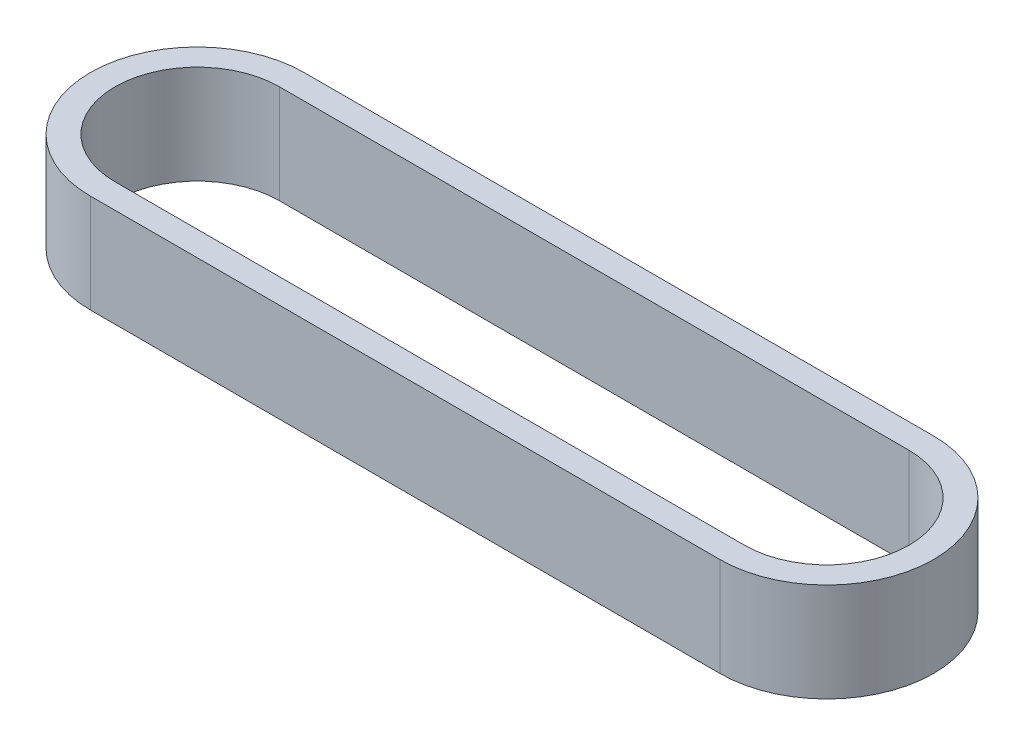
ISO-10303-21;
HEADER;
FILE_DESCRIPTION(('STEP AP214'),'2;1');
FILE_NAME('part.step','',(''),(''),'','','');
FILE_SCHEMA(('AUTOMOTIVE_DESIGN { 1 0 10303 214 1 1 1 1 }'));
ENDSEC;
DATA;
#1=APPLICATION_CONTEXT('core data for automotive mechanical design processes');
#2=APPLICATION_PROTOCOL_DEFINITION('international standard','automotive_design',2000,#1);
#3=PRODUCT_CONTEXT('',#1,'mechanical');
#4=PRODUCT('Part','Part','',(#3));
#5=PRODUCT_RELATED_PRODUCT_CATEGORY('part','',(#4));
#6=PRODUCT_DEFINITION_FORMATION('','',#4);
#7=PRODUCT_DEFINITION_CONTEXT('part definition',#1,'design');
#8=PRODUCT_DEFINITION('design','',#6,#7);
#9=PRODUCT_DEFINITION_SHAPE('','',#8);
#10=(LENGTH_UNIT() NAMED_UNIT(*) SI_UNIT(.MILLI.,.METRE.));
#11=(NAMED_UNIT(*) PLANE_ANGLE_UNIT() SI_UNIT($,.RADIAN.));
#12=(NAMED_UNIT(*) SI_UNIT($,.STERADIAN.) SOLID_ANGLE_UNIT());
#13=UNCERTAINTY_MEASURE_WITH_UNIT(LENGTH_MEASURE(1.E-05),#10,'distance_accuracy_value','');
#14=(GEOMETRIC_REPRESENTATION_CONTEXT(3) GLOBAL_UNCERTAINTY_ASSIGNED_CONTEXT((#13)) GLOBAL_UNIT_ASSIGNED_CONTEXT((#10,
#11,#12)) REPRESENTATION_CONTEXT('',''));
#15=CARTESIAN_POINT('',(0.,0.,0.));
#16=DIRECTION('',(0.,0.,1.));
#17=DIRECTION('',(1.,0.,0.));
#18=AXIS2_PLACEMENT_3D('',#15,#16,#17);
#19=CARTESIAN_POINT('',(0.,3.,0.));
#20=DIRECTION('',(0.,1.,0.));
#21=DIRECTION('',(0.,0.,1.));
#22=AXIS2_PLACEMENT_3D('',#19,#20,#21);
#23=PLANE('',#22);
#24=CARTESIAN_POINT('',(0.,3.,0.));
#25=DIRECTION('',(0.,1.,0.));
#26=DIRECTION('',(0.,0.,1.));
#27=AXIS2_PLACEMENT_3D('',#24,#25,#26);
#28=CIRCLE('',#27,6.49999999999999);
#29=CARTESIAN_POINT('',(0.,3.,-6.49999999999999));
#30=VERTEX_POINT('',#29);
#31=CARTESIAN_POINT('',(0.,3.,6.49999999999999));
#32=VERTEX_POINT('',#31);
#33=EDGE_CURVE('E153',#30,#32,#28,.T.);
#34=ORIENTED_EDGE('',*,*,#33,.T.);
#35=DIRECTION('',(1.,0.,0.));
#36=VECTOR('',#35,1.);
#37=CARTESIAN_POINT('',(38.27,3.,6.5));
#38=LINE('',#37,#36);
#39=CARTESIAN_POINT('',(38.27,3.,6.5));
#40=VERTEX_POINT('',#39);
#41=EDGE_CURVE('E157',#32,#40,#38,.T.);
#42=ORIENTED_EDGE('',*,*,#41,.T.);
#43=CARTESIAN_POINT('',(38.27,3.,0.));
#44=DIRECTION('',(0.,1.,0.));
#45=DIRECTION('',(0.,0.,-1.));
#46=AXIS2_PLACEMENT_3D('',#43,#44,#45);
#47=CIRCLE('',#46,6.5);
#48=CARTESIAN_POINT('',(38.27,3.,-6.5));
#49=VERTEX_POINT('',#48);
#50=EDGE_CURVE('E161',#40,#49,#47,.T.);
#51=ORIENTED_EDGE('',*,*,#50,.T.);
#52=DIRECTION('',(-1.,0.,0.));
#53=VECTOR('',#52,1.);
#54=CARTESIAN_POINT('',(0.,3.,-6.49999999999999));
#55=LINE('',#54,#53);
#56=EDGE_CURVE('E164',#49,#30,#55,.T.);
#57=ORIENTED_EDGE('',*,*,#56,.T.);
#58=EDGE_LOOP('',(#34,#42,#51,#57));
#59=FACE_BOUND('',#58,.T.);
#60=DIRECTION('',(1.,0.,0.));
#61=VECTOR('',#60,1.);
#62=CARTESIAN_POINT('',(38.27,3.,5.));
#63=LINE('',#62,#61);
#64=CARTESIAN_POINT('',(0.,3.,4.99999999999999));
#65=VERTEX_POINT('',#64);
#66=CARTESIAN_POINT('',(38.27,3.,5.));
#67=VERTEX_POINT('',#66);
#68=EDGE_CURVE('E114',#65,#67,#63,.T.);
#69=ORIENTED_EDGE('',*,*,#68,.F.);
#70=CARTESIAN_POINT('',(0.,3.,0.));
#71=DIRECTION('',(0.,1.,0.));
#72=DIRECTION('',(0.,0.,1.));
#73=AXIS2_PLACEMENT_3D('',#70,#71,#72);
#74=CIRCLE('',#73,4.99999999999999);
#75=CARTESIAN_POINT('',(0.,3.,-4.99999999999999));
#76=VERTEX_POINT('',#75);
#77=EDGE_CURVE('E105',#76,#65,#74,.T.);
#78=ORIENTED_EDGE('',*,*,#77,.F.);
#79=DIRECTION('',(-1.,0.,0.));
#80=VECTOR('',#79,1.);
#81=CARTESIAN_POINT('',(0.,3.,-4.99999999999999));
#82=LINE('',#81,#80);
#83=CARTESIAN_POINT('',(38.27,3.,-5.));
#84=VERTEX_POINT('',#83);
#85=EDGE_CURVE('E131',#84,#76,#82,.T.);
#86=ORIENTED_EDGE('',*,*,#85,.F.);
#87=CARTESIAN_POINT('',(38.27,3.,0.));
#88=DIRECTION('',(0.,1.,0.));
#89=DIRECTION('',(0.,0.,-1.));
#90=AXIS2_PLACEMENT_3D('',#87,#88,#89);
#91=CIRCLE('',#90,5.);
#92=EDGE_CURVE('E127',#67,#84,#91,.T.);
#93=ORIENTED_EDGE('',*,*,#92,.F.);
#94=EDGE_LOOP('',(#69,#78,#86,#93));
#95=FACE_BOUND('',#94,.T.);
#96=ADVANCED_FACE('F39',(#59,#95),#23,.T.);
#97=CARTESIAN_POINT('',(0.,-3.,0.));
#98=DIRECTION('',(0.,1.,0.));
#99=DIRECTION('',(0.,0.,1.));
#100=AXIS2_PLACEMENT_3D('',#97,#98,#99);
#101=PLANE('',#100);
#102=CARTESIAN_POINT('',(0.,-3.,0.));
#103=DIRECTION('',(0.,1.,0.));
#104=DIRECTION('',(0.,0.,1.));
#105=AXIS2_PLACEMENT_3D('',#102,#103,#104);
#106=CIRCLE('',#105,6.49999999999999);
#107=CARTESIAN_POINT('',(0.,-3.,-6.49999999999999));
#108=VERTEX_POINT('',#107);
#109=CARTESIAN_POINT('',(0.,-3.,6.49999999999999));
#110=VERTEX_POINT('',#109);
#111=EDGE_CURVE('E123',#108,#110,#106,.T.);
#112=ORIENTED_EDGE('',*,*,#111,.F.);
#113=DIRECTION('',(-1.,0.,0.));
#114=VECTOR('',#113,1.);
#115=CARTESIAN_POINT('',(0.,-3.,-6.49999999999999));
#116=LINE('',#115,#114);
#117=CARTESIAN_POINT('',(38.27,-3.,-6.5));
#118=VERTEX_POINT('',#117);
#119=EDGE_CURVE('E158',#118,#108,#116,.T.);
#120=ORIENTED_EDGE('',*,*,#119,.F.);
#121=CARTESIAN_POINT('',(38.27,-3.,0.));
#122=DIRECTION('',(0.,1.,0.));
#123=DIRECTION('',(0.,0.,-1.));
#124=AXIS2_PLACEMENT_3D('',#121,#122,#123);
#125=CIRCLE('',#124,6.5);
#126=CARTESIAN_POINT('',(38.27,-3.,6.5));
#127=VERTEX_POINT('',#126);
#128=EDGE_CURVE('E174',#127,#118,#125,.T.);
#129=ORIENTED_EDGE('',*,*,#128,.F.);
#130=DIRECTION('',(1.,0.,0.));
#131=VECTOR('',#130,1.);
#132=CARTESIAN_POINT('',(38.27,-3.,6.5));
#133=LINE('',#132,#131);
#134=EDGE_CURVE('E171',#110,#127,#133,.T.);
#135=ORIENTED_EDGE('',*,*,#134,.F.);
#136=EDGE_LOOP('',(#112,#120,#129,#135));
#137=FACE_BOUND('',#136,.T.);
#138=CARTESIAN_POINT('',(0.,-3.,0.));
#139=DIRECTION('',(0.,1.,0.));
#140=DIRECTION('',(0.,0.,1.));
#141=AXIS2_PLACEMENT_3D('',#138,#139,#140);
#142=CIRCLE('',#141,4.99999999999999);
#143=CARTESIAN_POINT('',(0.,-3.,-4.99999999999999));
#144=VERTEX_POINT('',#143);
#145=CARTESIAN_POINT('',(0.,-3.,4.99999999999999));
#146=VERTEX_POINT('',#145);
#147=EDGE_CURVE('E63',#144,#146,#142,.T.);
#148=ORIENTED_EDGE('',*,*,#147,.T.);
#149=DIRECTION('',(1.,0.,0.));
#150=VECTOR('',#149,1.);
#151=CARTESIAN_POINT('',(38.27,-3.,5.));
#152=LINE('',#151,#150);
#153=CARTESIAN_POINT('',(38.27,-3.,5.));
#154=VERTEX_POINT('',#153);
#155=EDGE_CURVE('E121',#146,#154,#152,.T.);
#156=ORIENTED_EDGE('',*,*,#155,.T.);
#157=CARTESIAN_POINT('',(38.27,-3.,0.));
#158=DIRECTION('',(0.,1.,0.));
#159=DIRECTION('',(0.,0.,-1.));
#160=AXIS2_PLACEMENT_3D('',#157,#158,#159);
#161=CIRCLE('',#160,5.);
#162=CARTESIAN_POINT('',(38.27,-3.,-5.));
#163=VERTEX_POINT('',#162);
#164=EDGE_CURVE('E140',#154,#163,#161,.T.);
#165=ORIENTED_EDGE('',*,*,#164,.T.);
#166=DIRECTION('',(-1.,0.,0.));
#167=VECTOR('',#166,1.);
#168=CARTESIAN_POINT('',(0.,-3.,-4.99999999999999));
#169=LINE('',#168,#167);
#170=EDGE_CURVE('E115',#163,#144,#169,.T.);
#171=ORIENTED_EDGE('',*,*,#170,.T.);
#172=EDGE_LOOP('',(#148,#156,#165,#171));
#173=FACE_BOUND('',#172,.T.);
#174=ADVANCED_FACE('F197',(#137,#173),#101,.F.);
#175=CARTESIAN_POINT('',(0.,3.,0.));
#176=DIRECTION('',(0.,-1.,0.));
#177=DIRECTION('',(0.,0.,-1.));
#178=AXIS2_PLACEMENT_3D('',#175,#176,#177);
#179=CYLINDRICAL_SURFACE('',#178,6.49999999999999);
#180=ORIENTED_EDGE('',*,*,#111,.T.);
#181=DIRECTION('',(0.,-1.,0.));
#182=VECTOR('',#181,1.);
#183=CARTESIAN_POINT('',(0.,3.,6.49999999999999));
#184=LINE('',#183,#182);
#185=EDGE_CURVE('E11',#32,#110,#184,.T.);
#186=ORIENTED_EDGE('',*,*,#185,.F.);
#187=ORIENTED_EDGE('',*,*,#33,.F.);
#188=DIRECTION('',(0.,-1.,0.));
#189=VECTOR('',#188,1.);
#190=CARTESIAN_POINT('',(0.,3.,-6.49999999999999));
#191=LINE('',#190,#189);
#192=EDGE_CURVE('E167',#30,#108,#191,.T.);
#193=ORIENTED_EDGE('',*,*,#192,.T.);
#194=EDGE_LOOP('',(#180,#186,#187,#193));
#195=FACE_BOUND('',#194,.T.);
#196=ADVANCED_FACE('F41',(#195),#179,.T.);
#197=CARTESIAN_POINT('',(38.27,3.,6.5));
#198=DIRECTION('',(0.,0.,-1.));
#199=DIRECTION('',(-1.,0.,0.));
#200=AXIS2_PLACEMENT_3D('',#197,#198,#199);
#201=PLANE('',#200);
#202=ORIENTED_EDGE('',*,*,#134,.T.);
#203=DIRECTION('',(0.,-1.,0.));
#204=VECTOR('',#203,1.);
#205=CARTESIAN_POINT('',(38.27,3.,6.5));
#206=LINE('',#205,#204);
#207=EDGE_CURVE('E48',#40,#127,#206,.T.);
#208=ORIENTED_EDGE('',*,*,#207,.F.);
#209=ORIENTED_EDGE('',*,*,#41,.F.);
#210=ORIENTED_EDGE('',*,*,#185,.T.);
#211=EDGE_LOOP('',(#202,#208,#209,#210));
#212=FACE_BOUND('',#211,.T.);
#213=ADVANCED_FACE('F207',(#212),#201,.F.);
#214=CARTESIAN_POINT('',(38.27,3.,0.));
#215=DIRECTION('',(0.,-1.,0.));
#216=DIRECTION('',(0.,0.,-1.));
#217=AXIS2_PLACEMENT_3D('',#214,#215,#216);
#218=CYLINDRICAL_SURFACE('',#217,6.5);
#219=ORIENTED_EDGE('',*,*,#128,.T.);
#220=DIRECTION('',(0.,-1.,0.));
#221=VECTOR('',#220,1.);
#222=CARTESIAN_POINT('',(38.27,3.,-6.5));
#223=LINE('',#222,#221);
#224=EDGE_CURVE('E182',#49,#118,#223,.T.);
#225=ORIENTED_EDGE('',*,*,#224,.F.);
#226=ORIENTED_EDGE('',*,*,#50,.F.);
#227=ORIENTED_EDGE('',*,*,#207,.T.);
#228=EDGE_LOOP('',(#219,#225,#226,#227));
#229=FACE_BOUND('',#228,.T.);
#230=ADVANCED_FACE('F191',(#229),#218,.T.);
#231=CARTESIAN_POINT('',(0.,3.,-6.49999999999999));
#232=DIRECTION('',(0.,0.,1.));
#233=DIRECTION('',(1.,0.,0.));
#234=AXIS2_PLACEMENT_3D('',#231,#232,#233);
#235=PLANE('',#234);
#236=ORIENTED_EDGE('',*,*,#119,.T.);
#237=ORIENTED_EDGE('',*,*,#192,.F.);
#238=ORIENTED_EDGE('',*,*,#56,.F.);
#239=ORIENTED_EDGE('',*,*,#224,.T.);
#240=EDGE_LOOP('',(#236,#237,#238,#239));
#241=FACE_BOUND('',#240,.T.);
#242=ADVANCED_FACE('F201',(#241),#235,.F.);
#243=CARTESIAN_POINT('',(0.,3.,0.));
#244=DIRECTION('',(0.,-1.,0.));
#245=DIRECTION('',(0.,0.,-1.));
#246=AXIS2_PLACEMENT_3D('',#243,#244,#245);
#247=CYLINDRICAL_SURFACE('',#246,4.99999999999999);
#248=ORIENTED_EDGE('',*,*,#147,.F.);
#249=DIRECTION('',(0.,-1.,0.));
#250=VECTOR('',#249,1.);
#251=CARTESIAN_POINT('',(0.,3.,-4.99999999999999));
#252=LINE('',#251,#250);
#253=EDGE_CURVE('E109',#76,#144,#252,.T.);
#254=ORIENTED_EDGE('',*,*,#253,.F.);
#255=ORIENTED_EDGE('',*,*,#77,.T.);
#256=DIRECTION('',(0.,-1.,0.));
#257=VECTOR('',#256,1.);
#258=CARTESIAN_POINT('',(0.,3.,4.99999999999999));
#259=LINE('',#258,#257);
#260=EDGE_CURVE('E108',#65,#146,#259,.T.);
#261=ORIENTED_EDGE('',*,*,#260,.T.);
#262=EDGE_LOOP('',(#248,#254,#255,#261));
#263=FACE_BOUND('',#262,.T.);
#264=ADVANCED_FACE('F107',(#263),#247,.F.);
#265=CARTESIAN_POINT('',(38.27,3.,5.));
#266=DIRECTION('',(0.,0.,-1.));
#267=DIRECTION('',(-1.,0.,0.));
#268=AXIS2_PLACEMENT_3D('',#265,#266,#267);
#269=PLANE('',#268);
#270=ORIENTED_EDGE('',*,*,#155,.F.);
#271=ORIENTED_EDGE('',*,*,#260,.F.);
#272=ORIENTED_EDGE('',*,*,#68,.T.);
#273=DIRECTION('',(0.,-1.,0.));
#274=VECTOR('',#273,1.);
#275=CARTESIAN_POINT('',(38.27,3.,5.));
#276=LINE('',#275,#274);
#277=EDGE_CURVE('E124',#67,#154,#276,.T.);
#278=ORIENTED_EDGE('',*,*,#277,.T.);
#279=EDGE_LOOP('',(#270,#271,#272,#278));
#280=FACE_BOUND('',#279,.T.);
#281=ADVANCED_FACE('F118',(#280),#269,.T.);
#282=CARTESIAN_POINT('',(38.27,3.,0.));
#283=DIRECTION('',(0.,-1.,0.));
#284=DIRECTION('',(0.,0.,-1.));
#285=AXIS2_PLACEMENT_3D('',#282,#283,#284);
#286=CYLINDRICAL_SURFACE('',#285,5.);
#287=ORIENTED_EDGE('',*,*,#164,.F.);
#288=ORIENTED_EDGE('',*,*,#277,.F.);
#289=ORIENTED_EDGE('',*,*,#92,.T.);
#290=DIRECTION('',(0.,-1.,0.));
#291=VECTOR('',#290,1.);
#292=CARTESIAN_POINT('',(38.27,3.,-5.));
#293=LINE('',#292,#291);
#294=EDGE_CURVE('E55',#84,#163,#293,.T.);
#295=ORIENTED_EDGE('',*,*,#294,.T.);
#296=EDGE_LOOP('',(#287,#288,#289,#295));
#297=FACE_BOUND('',#296,.T.);
#298=ADVANCED_FACE('F230',(#297),#286,.F.);
#299=CARTESIAN_POINT('',(0.,3.,-4.99999999999999));
#300=DIRECTION('',(0.,0.,1.));
#301=DIRECTION('',(1.,0.,0.));
#302=AXIS2_PLACEMENT_3D('',#299,#300,#301);
#303=PLANE('',#302);
#304=ORIENTED_EDGE('',*,*,#170,.F.);
#305=ORIENTED_EDGE('',*,*,#294,.F.);
#306=ORIENTED_EDGE('',*,*,#85,.T.);
#307=ORIENTED_EDGE('',*,*,#253,.T.);
#308=EDGE_LOOP('',(#304,#305,#306,#307));
#309=FACE_BOUND('',#308,.T.);
#310=ADVANCED_FACE('F234',(#309),#303,.T.);
#311=CLOSED_SHELL('',(#96,#174,#196,#213,#230,#242,#264,#281,#298,#310));
#312=MANIFOLD_SOLID_BREP('B2',#311);
#313=ADVANCED_BREP_SHAPE_REPRESENTATION('',(#18,#312),#14);
#314=SHAPE_DEFINITION_REPRESENTATION(#9,#313);
ENDSEC;
END-ISO-10303-21;
